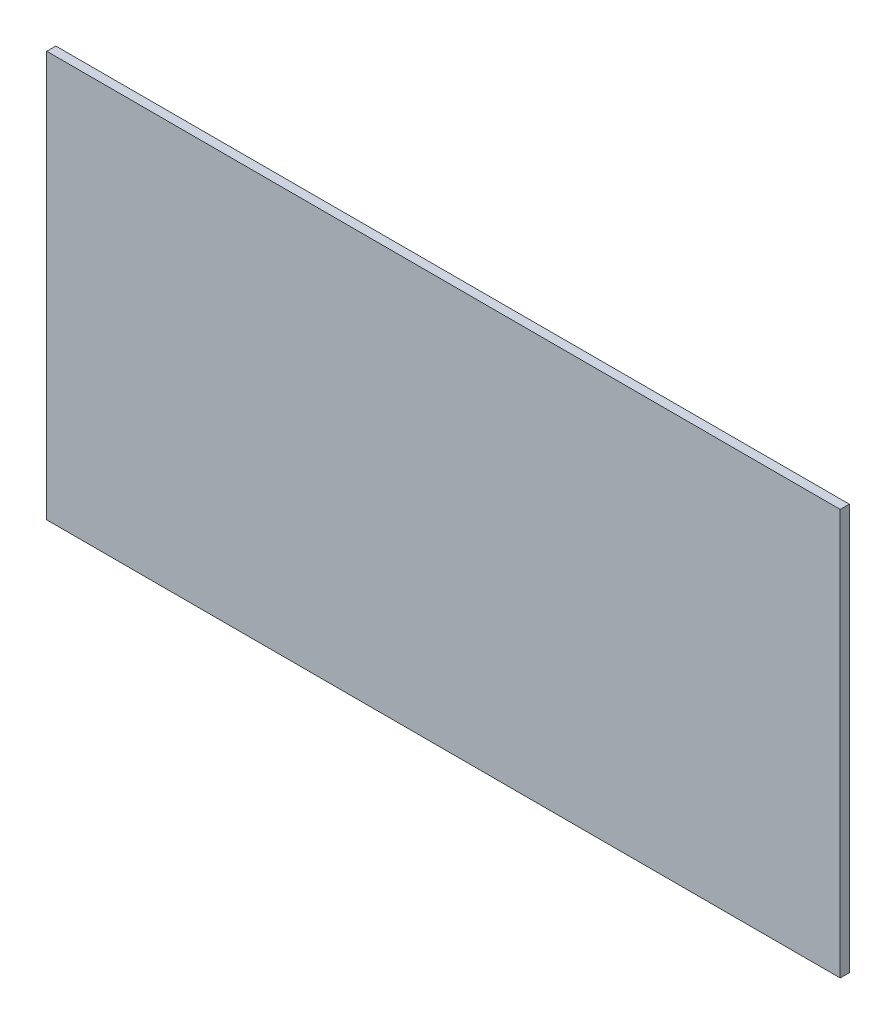
ISO-10303-21;
HEADER;
FILE_DESCRIPTION(('STEP AP214'),'2;1');
FILE_NAME('part.step','',(''),(''),'','','');
FILE_SCHEMA(('AUTOMOTIVE_DESIGN { 1 0 10303 214 1 1 1 1 }'));
ENDSEC;
DATA;
#1=APPLICATION_CONTEXT('core data for automotive mechanical design processes');
#2=APPLICATION_PROTOCOL_DEFINITION('international standard','automotive_design',2000,#1);
#3=PRODUCT_CONTEXT('',#1,'mechanical');
#4=PRODUCT('Part','Part','',(#3));
#5=PRODUCT_RELATED_PRODUCT_CATEGORY('part','',(#4));
#6=PRODUCT_DEFINITION_FORMATION('','',#4);
#7=PRODUCT_DEFINITION_CONTEXT('part definition',#1,'design');
#8=PRODUCT_DEFINITION('design','',#6,#7);
#9=PRODUCT_DEFINITION_SHAPE('','',#8);
#10=(LENGTH_UNIT() NAMED_UNIT(*) SI_UNIT(.MILLI.,.METRE.));
#11=(NAMED_UNIT(*) PLANE_ANGLE_UNIT() SI_UNIT($,.RADIAN.));
#12=(NAMED_UNIT(*) SI_UNIT($,.STERADIAN.) SOLID_ANGLE_UNIT());
#13=UNCERTAINTY_MEASURE_WITH_UNIT(LENGTH_MEASURE(1.E-05),#10,'distance_accuracy_value','');
#14=(GEOMETRIC_REPRESENTATION_CONTEXT(3) GLOBAL_UNCERTAINTY_ASSIGNED_CONTEXT((#13)) GLOBAL_UNIT_ASSIGNED_CONTEXT((#10,
#11,#12)) REPRESENTATION_CONTEXT('',''));
#15=CARTESIAN_POINT('',(0.,0.,0.));
#16=DIRECTION('',(0.,0.,1.));
#17=DIRECTION('',(1.,0.,0.));
#18=AXIS2_PLACEMENT_3D('',#15,#16,#17);
#19=CARTESIAN_POINT('',(65.5,-33.5,1.5));
#20=DIRECTION('',(-1.,0.,0.));
#21=DIRECTION('',(0.,0.,1.));
#22=AXIS2_PLACEMENT_3D('',#19,#20,#21);
#23=PLANE('',#22);
#24=DIRECTION('',(0.,1.,0.));
#25=VECTOR('',#24,1.);
#26=CARTESIAN_POINT('',(65.5,-33.5,0.));
#27=LINE('',#26,#25);
#28=CARTESIAN_POINT('',(65.5,-33.5,0.));
#29=VERTEX_POINT('',#28);
#30=CARTESIAN_POINT('',(65.5,33.5,0.));
#31=VERTEX_POINT('',#30);
#32=EDGE_CURVE('E98',#29,#31,#27,.T.);
#33=ORIENTED_EDGE('',*,*,#32,.T.);
#34=DIRECTION('',(0.,0.,-1.));
#35=VECTOR('',#34,1.);
#36=CARTESIAN_POINT('',(65.5,33.5,1.5));
#37=LINE('',#36,#35);
#38=CARTESIAN_POINT('',(65.5,33.5,1.5));
#39=VERTEX_POINT('',#38);
#40=EDGE_CURVE('E11',#39,#31,#37,.T.);
#41=ORIENTED_EDGE('',*,*,#40,.F.);
#42=DIRECTION('',(0.,1.,0.));
#43=VECTOR('',#42,1.);
#44=CARTESIAN_POINT('',(65.5,-33.5,1.5));
#45=LINE('',#44,#43);
#46=CARTESIAN_POINT('',(65.5,-33.5,1.5));
#47=VERTEX_POINT('',#46);
#48=EDGE_CURVE('E86',#47,#39,#45,.T.);
#49=ORIENTED_EDGE('',*,*,#48,.F.);
#50=DIRECTION('',(0.,0.,-1.));
#51=VECTOR('',#50,1.);
#52=CARTESIAN_POINT('',(65.5,-33.5,1.5));
#53=LINE('',#52,#51);
#54=EDGE_CURVE('E94',#47,#29,#53,.T.);
#55=ORIENTED_EDGE('',*,*,#54,.T.);
#56=EDGE_LOOP('',(#33,#41,#49,#55));
#57=FACE_BOUND('',#56,.T.);
#58=ADVANCED_FACE('F35',(#57),#23,.F.);
#59=CARTESIAN_POINT('',(-65.5,33.5,1.5));
#60=DIRECTION('',(0.,-1.,0.));
#61=DIRECTION('',(0.,0.,-1.));
#62=AXIS2_PLACEMENT_3D('',#59,#60,#61);
#63=PLANE('',#62);
#64=DIRECTION('',(-1.,0.,0.));
#65=VECTOR('',#64,1.);
#66=CARTESIAN_POINT('',(-65.5,33.5,0.));
#67=LINE('',#66,#65);
#68=CARTESIAN_POINT('',(-65.5,33.5,0.));
#69=VERTEX_POINT('',#68);
#70=EDGE_CURVE('E90',#31,#69,#67,.T.);
#71=ORIENTED_EDGE('',*,*,#70,.T.);
#72=DIRECTION('',(0.,0.,-1.));
#73=VECTOR('',#72,1.);
#74=CARTESIAN_POINT('',(-65.5,33.5,1.5));
#75=LINE('',#74,#73);
#76=CARTESIAN_POINT('',(-65.5,33.5,1.5));
#77=VERTEX_POINT('',#76);
#78=EDGE_CURVE('E43',#77,#69,#75,.T.);
#79=ORIENTED_EDGE('',*,*,#78,.F.);
#80=DIRECTION('',(-1.,0.,0.));
#81=VECTOR('',#80,1.);
#82=CARTESIAN_POINT('',(-65.5,33.5,1.5));
#83=LINE('',#82,#81);
#84=EDGE_CURVE('E81',#39,#77,#83,.T.);
#85=ORIENTED_EDGE('',*,*,#84,.F.);
#86=ORIENTED_EDGE('',*,*,#40,.T.);
#87=EDGE_LOOP('',(#71,#79,#85,#86));
#88=FACE_BOUND('',#87,.T.);
#89=ADVANCED_FACE('F89',(#88),#63,.F.);
#90=CARTESIAN_POINT('',(-65.5,-33.5,1.5));
#91=DIRECTION('',(1.,0.,0.));
#92=DIRECTION('',(0.,0.,-1.));
#93=AXIS2_PLACEMENT_3D('',#90,#91,#92);
#94=PLANE('',#93);
#95=DIRECTION('',(0.,-1.,0.));
#96=VECTOR('',#95,1.);
#97=CARTESIAN_POINT('',(-65.5,-33.5,0.));
#98=LINE('',#97,#96);
#99=CARTESIAN_POINT('',(-65.5,-33.5,0.));
#100=VERTEX_POINT('',#99);
#101=EDGE_CURVE('E68',#69,#100,#98,.T.);
#102=ORIENTED_EDGE('',*,*,#101,.T.);
#103=DIRECTION('',(0.,0.,-1.));
#104=VECTOR('',#103,1.);
#105=CARTESIAN_POINT('',(-65.5,-33.5,1.5));
#106=LINE('',#105,#104);
#107=CARTESIAN_POINT('',(-65.5,-33.5,1.5));
#108=VERTEX_POINT('',#107);
#109=EDGE_CURVE('E91',#108,#100,#106,.T.);
#110=ORIENTED_EDGE('',*,*,#109,.F.);
#111=DIRECTION('',(0.,-1.,0.));
#112=VECTOR('',#111,1.);
#113=CARTESIAN_POINT('',(-65.5,-33.5,1.5));
#114=LINE('',#113,#112);
#115=EDGE_CURVE('E84',#77,#108,#114,.T.);
#116=ORIENTED_EDGE('',*,*,#115,.F.);
#117=ORIENTED_EDGE('',*,*,#78,.T.);
#118=EDGE_LOOP('',(#102,#110,#116,#117));
#119=FACE_BOUND('',#118,.T.);
#120=ADVANCED_FACE('F92',(#119),#94,.F.);
#121=CARTESIAN_POINT('',(-65.5,-33.5,1.5));
#122=DIRECTION('',(0.,1.,0.));
#123=DIRECTION('',(0.,0.,1.));
#124=AXIS2_PLACEMENT_3D('',#121,#122,#123);
#125=PLANE('',#124);
#126=DIRECTION('',(1.,0.,0.));
#127=VECTOR('',#126,1.);
#128=CARTESIAN_POINT('',(-65.5,-33.5,0.));
#129=LINE('',#128,#127);
#130=EDGE_CURVE('E74',#100,#29,#129,.T.);
#131=ORIENTED_EDGE('',*,*,#130,.T.);
#132=ORIENTED_EDGE('',*,*,#54,.F.);
#133=DIRECTION('',(1.,0.,0.));
#134=VECTOR('',#133,1.);
#135=CARTESIAN_POINT('',(-65.5,-33.5,1.5));
#136=LINE('',#135,#134);
#137=EDGE_CURVE('E51',#108,#47,#136,.T.);
#138=ORIENTED_EDGE('',*,*,#137,.F.);
#139=ORIENTED_EDGE('',*,*,#109,.T.);
#140=EDGE_LOOP('',(#131,#132,#138,#139));
#141=FACE_BOUND('',#140,.T.);
#142=ADVANCED_FACE('F105',(#141),#125,.F.);
#143=CARTESIAN_POINT('',(0.,0.,1.5));
#144=DIRECTION('',(0.,0.,-1.));
#145=DIRECTION('',(-1.,0.,0.));
#146=AXIS2_PLACEMENT_3D('',#143,#144,#145);
#147=PLANE('',#146);
#148=ORIENTED_EDGE('',*,*,#48,.T.);
#149=ORIENTED_EDGE('',*,*,#84,.T.);
#150=ORIENTED_EDGE('',*,*,#115,.T.);
#151=ORIENTED_EDGE('',*,*,#137,.T.);
#152=EDGE_LOOP('',(#148,#149,#150,#151));
#153=FACE_BOUND('',#152,.T.);
#154=ADVANCED_FACE('F82',(#153),#147,.F.);
#155=CARTESIAN_POINT('',(0.,0.,0.));
#156=DIRECTION('',(0.,0.,-1.));
#157=DIRECTION('',(-1.,0.,0.));
#158=AXIS2_PLACEMENT_3D('',#155,#156,#157);
#159=PLANE('',#158);
#160=ORIENTED_EDGE('',*,*,#32,.F.);
#161=ORIENTED_EDGE('',*,*,#130,.F.);
#162=ORIENTED_EDGE('',*,*,#101,.F.);
#163=ORIENTED_EDGE('',*,*,#70,.F.);
#164=EDGE_LOOP('',(#160,#161,#162,#163));
#165=FACE_BOUND('',#164,.T.);
#166=ADVANCED_FACE('F108',(#165),#159,.T.);
#167=CLOSED_SHELL('',(#58,#89,#120,#142,#154,#166));
#168=MANIFOLD_SOLID_BREP('B2',#167);
#169=ADVANCED_BREP_SHAPE_REPRESENTATION('',(#18,#168),#14);
#170=SHAPE_DEFINITION_REPRESENTATION(#9,#169);
ENDSEC;
END-ISO-10303-21;
